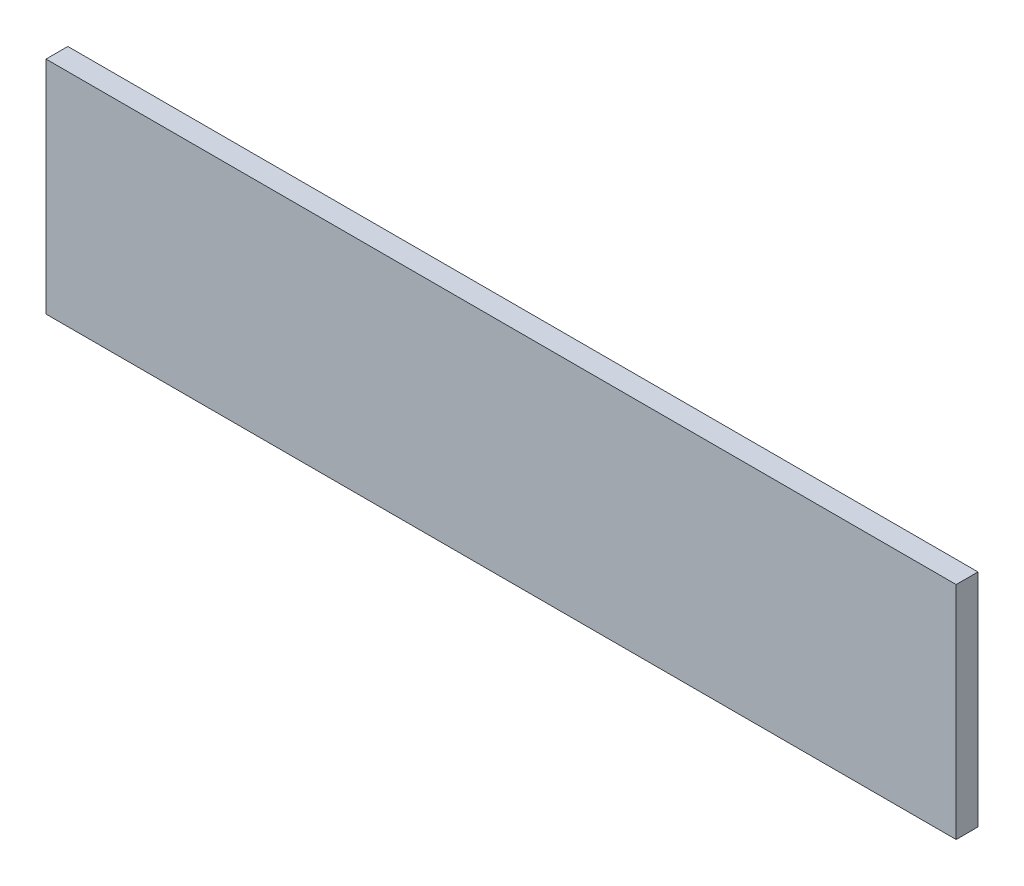
ISO-10303-21;
HEADER;
FILE_DESCRIPTION(('STEP AP214'),'2;1');
FILE_NAME('part.step','',(''),(''),'','','');
FILE_SCHEMA(('AUTOMOTIVE_DESIGN { 1 0 10303 214 1 1 1 1 }'));
ENDSEC;
DATA;
#1=APPLICATION_CONTEXT('core data for automotive mechanical design processes');
#2=APPLICATION_PROTOCOL_DEFINITION('international standard','automotive_design',2000,#1);
#3=PRODUCT_CONTEXT('',#1,'mechanical');
#4=PRODUCT('Part','Part','',(#3));
#5=PRODUCT_RELATED_PRODUCT_CATEGORY('part','',(#4));
#6=PRODUCT_DEFINITION_FORMATION('','',#4);
#7=PRODUCT_DEFINITION_CONTEXT('part definition',#1,'design');
#8=PRODUCT_DEFINITION('design','',#6,#7);
#9=PRODUCT_DEFINITION_SHAPE('','',#8);
#10=(LENGTH_UNIT() NAMED_UNIT(*) SI_UNIT(.MILLI.,.METRE.));
#11=(NAMED_UNIT(*) PLANE_ANGLE_UNIT() SI_UNIT($,.RADIAN.));
#12=(NAMED_UNIT(*) SI_UNIT($,.STERADIAN.) SOLID_ANGLE_UNIT());
#13=UNCERTAINTY_MEASURE_WITH_UNIT(LENGTH_MEASURE(1.E-05),#10,'distance_accuracy_value','');
#14=(GEOMETRIC_REPRESENTATION_CONTEXT(3) GLOBAL_UNCERTAINTY_ASSIGNED_CONTEXT((#13)) GLOBAL_UNIT_ASSIGNED_CONTEXT((#10,
#11,#12)) REPRESENTATION_CONTEXT('',''));
#15=CARTESIAN_POINT('',(0.,0.,0.));
#16=DIRECTION('',(0.,0.,1.));
#17=DIRECTION('',(1.,0.,0.));
#18=AXIS2_PLACEMENT_3D('',#15,#16,#17);
#19=CARTESIAN_POINT('',(-322.443113772455,234.22754491018,18.288));
#20=DIRECTION('',(1.,0.,0.));
#21=DIRECTION('',(0.,0.,-1.));
#22=AXIS2_PLACEMENT_3D('',#19,#20,#21);
#23=PLANE('',#22);
#24=DIRECTION('',(0.,-1.,0.));
#25=VECTOR('',#24,1.);
#26=CARTESIAN_POINT('',(-322.443113772455,234.22754491018,0.));
#27=LINE('',#26,#25);
#28=CARTESIAN_POINT('',(-322.443113772455,234.22754491018,0.));
#29=VERTEX_POINT('',#28);
#30=CARTESIAN_POINT('',(-322.443113772455,49.3155449101796,0.));
#31=VERTEX_POINT('',#30);
#32=EDGE_CURVE('E107',#29,#31,#27,.T.);
#33=ORIENTED_EDGE('',*,*,#32,.T.);
#34=DIRECTION('',(0.,0.,-1.));
#35=VECTOR('',#34,1.);
#36=CARTESIAN_POINT('',(-322.443113772455,49.3155449101796,18.288));
#37=LINE('',#36,#35);
#38=CARTESIAN_POINT('',(-322.443113772455,49.3155449101796,18.288));
#39=VERTEX_POINT('',#38);
#40=EDGE_CURVE('E11',#39,#31,#37,.T.);
#41=ORIENTED_EDGE('',*,*,#40,.F.);
#42=DIRECTION('',(0.,-1.,0.));
#43=VECTOR('',#42,1.);
#44=CARTESIAN_POINT('',(-322.443113772455,234.22754491018,18.288));
#45=LINE('',#44,#43);
#46=CARTESIAN_POINT('',(-322.443113772455,234.22754491018,18.288));
#47=VERTEX_POINT('',#46);
#48=EDGE_CURVE('E91',#47,#39,#45,.T.);
#49=ORIENTED_EDGE('',*,*,#48,.F.);
#50=DIRECTION('',(0.,0.,-1.));
#51=VECTOR('',#50,1.);
#52=CARTESIAN_POINT('',(-322.443113772455,234.22754491018,18.288));
#53=LINE('',#52,#51);
#54=EDGE_CURVE('E103',#47,#29,#53,.T.);
#55=ORIENTED_EDGE('',*,*,#54,.T.);
#56=EDGE_LOOP('',(#33,#41,#49,#55));
#57=FACE_BOUND('',#56,.T.);
#58=ADVANCED_FACE('F39',(#57),#23,.F.);
#59=CARTESIAN_POINT('',(-322.443113772455,49.3155449101796,18.288));
#60=DIRECTION('',(0.,1.,0.));
#61=DIRECTION('',(0.,0.,1.));
#62=AXIS2_PLACEMENT_3D('',#59,#60,#61);
#63=PLANE('',#62);
#64=DIRECTION('',(1.,0.,0.));
#65=VECTOR('',#64,1.);
#66=CARTESIAN_POINT('',(-322.443113772455,49.3155449101796,0.));
#67=LINE('',#66,#65);
#68=CARTESIAN_POINT('',(439.556886227545,49.3155449101796,0.));
#69=VERTEX_POINT('',#68);
#70=EDGE_CURVE('E96',#31,#69,#67,.T.);
#71=ORIENTED_EDGE('',*,*,#70,.T.);
#72=DIRECTION('',(0.,0.,-1.));
#73=VECTOR('',#72,1.);
#74=CARTESIAN_POINT('',(439.556886227545,49.3155449101796,18.288));
#75=LINE('',#74,#73);
#76=CARTESIAN_POINT('',(439.556886227545,49.3155449101796,18.288));
#77=VERTEX_POINT('',#76);
#78=EDGE_CURVE('E48',#77,#69,#75,.T.);
#79=ORIENTED_EDGE('',*,*,#78,.F.);
#80=DIRECTION('',(1.,0.,0.));
#81=VECTOR('',#80,1.);
#82=CARTESIAN_POINT('',(-322.443113772455,49.3155449101796,18.288));
#83=LINE('',#82,#81);
#84=EDGE_CURVE('E86',#39,#77,#83,.T.);
#85=ORIENTED_EDGE('',*,*,#84,.F.);
#86=ORIENTED_EDGE('',*,*,#40,.T.);
#87=EDGE_LOOP('',(#71,#79,#85,#86));
#88=FACE_BOUND('',#87,.T.);
#89=ADVANCED_FACE('F95',(#88),#63,.F.);
#90=CARTESIAN_POINT('',(439.556886227545,234.22754491018,18.288));
#91=DIRECTION('',(-1.,0.,0.));
#92=DIRECTION('',(0.,-1.,0.));
#93=AXIS2_PLACEMENT_3D('',#90,#91,#92);
#94=PLANE('',#93);
#95=DIRECTION('',(0.,1.,0.));
#96=VECTOR('',#95,1.);
#97=CARTESIAN_POINT('',(439.556886227545,234.22754491018,0.));
#98=LINE('',#97,#96);
#99=CARTESIAN_POINT('',(439.556886227545,234.22754491018,0.));
#100=VERTEX_POINT('',#99);
#101=EDGE_CURVE('E73',#69,#100,#98,.T.);
#102=ORIENTED_EDGE('',*,*,#101,.T.);
#103=DIRECTION('',(0.,0.,-1.));
#104=VECTOR('',#103,1.);
#105=CARTESIAN_POINT('',(439.556886227545,234.22754491018,18.288));
#106=LINE('',#105,#104);
#107=CARTESIAN_POINT('',(439.556886227545,234.22754491018,18.288));
#108=VERTEX_POINT('',#107);
#109=EDGE_CURVE('E98',#108,#100,#106,.T.);
#110=ORIENTED_EDGE('',*,*,#109,.F.);
#111=DIRECTION('',(0.,1.,0.));
#112=VECTOR('',#111,1.);
#113=CARTESIAN_POINT('',(439.556886227545,234.22754491018,18.288));
#114=LINE('',#113,#112);
#115=EDGE_CURVE('E89',#77,#108,#114,.T.);
#116=ORIENTED_EDGE('',*,*,#115,.F.);
#117=ORIENTED_EDGE('',*,*,#78,.T.);
#118=EDGE_LOOP('',(#102,#110,#116,#117));
#119=FACE_BOUND('',#118,.T.);
#120=ADVANCED_FACE('F99',(#119),#94,.F.);
#121=CARTESIAN_POINT('',(-322.443113772455,234.22754491018,18.288));
#122=DIRECTION('',(0.,-1.,0.));
#123=DIRECTION('',(0.,0.,-1.));
#124=AXIS2_PLACEMENT_3D('',#121,#122,#123);
#125=PLANE('',#124);
#126=DIRECTION('',(-1.,0.,0.));
#127=VECTOR('',#126,1.);
#128=CARTESIAN_POINT('',(-322.443113772455,234.22754491018,0.));
#129=LINE('',#128,#127);
#130=EDGE_CURVE('E79',#100,#29,#129,.T.);
#131=ORIENTED_EDGE('',*,*,#130,.T.);
#132=ORIENTED_EDGE('',*,*,#54,.F.);
#133=DIRECTION('',(-1.,0.,0.));
#134=VECTOR('',#133,1.);
#135=CARTESIAN_POINT('',(-322.443113772455,234.22754491018,18.288));
#136=LINE('',#135,#134);
#137=EDGE_CURVE('E56',#108,#47,#136,.T.);
#138=ORIENTED_EDGE('',*,*,#137,.F.);
#139=ORIENTED_EDGE('',*,*,#109,.T.);
#140=EDGE_LOOP('',(#131,#132,#138,#139));
#141=FACE_BOUND('',#140,.T.);
#142=ADVANCED_FACE('F120',(#141),#125,.F.);
#143=CARTESIAN_POINT('',(0.,0.,18.288));
#144=DIRECTION('',(0.,0.,1.));
#145=DIRECTION('',(1.,0.,0.));
#146=AXIS2_PLACEMENT_3D('',#143,#144,#145);
#147=PLANE('',#146);
#148=ORIENTED_EDGE('',*,*,#48,.T.);
#149=ORIENTED_EDGE('',*,*,#84,.T.);
#150=ORIENTED_EDGE('',*,*,#115,.T.);
#151=ORIENTED_EDGE('',*,*,#137,.T.);
#152=EDGE_LOOP('',(#148,#149,#150,#151));
#153=FACE_BOUND('',#152,.T.);
#154=ADVANCED_FACE('F87',(#153),#147,.T.);
#155=CARTESIAN_POINT('',(0.,0.,0.));
#156=DIRECTION('',(0.,0.,1.));
#157=DIRECTION('',(1.,0.,0.));
#158=AXIS2_PLACEMENT_3D('',#155,#156,#157);
#159=PLANE('',#158);
#160=ORIENTED_EDGE('',*,*,#32,.F.);
#161=ORIENTED_EDGE('',*,*,#130,.F.);
#162=ORIENTED_EDGE('',*,*,#101,.F.);
#163=ORIENTED_EDGE('',*,*,#70,.F.);
#164=EDGE_LOOP('',(#160,#161,#162,#163));
#165=FACE_BOUND('',#164,.T.);
#166=ADVANCED_FACE('F123',(#165),#159,.F.);
#167=CLOSED_SHELL('',(#58,#89,#120,#142,#154,#166));
#168=MANIFOLD_SOLID_BREP('B2',#167);
#169=ADVANCED_BREP_SHAPE_REPRESENTATION('',(#18,#168),#14);
#170=SHAPE_DEFINITION_REPRESENTATION(#9,#169);
ENDSEC;
END-ISO-10303-21;
